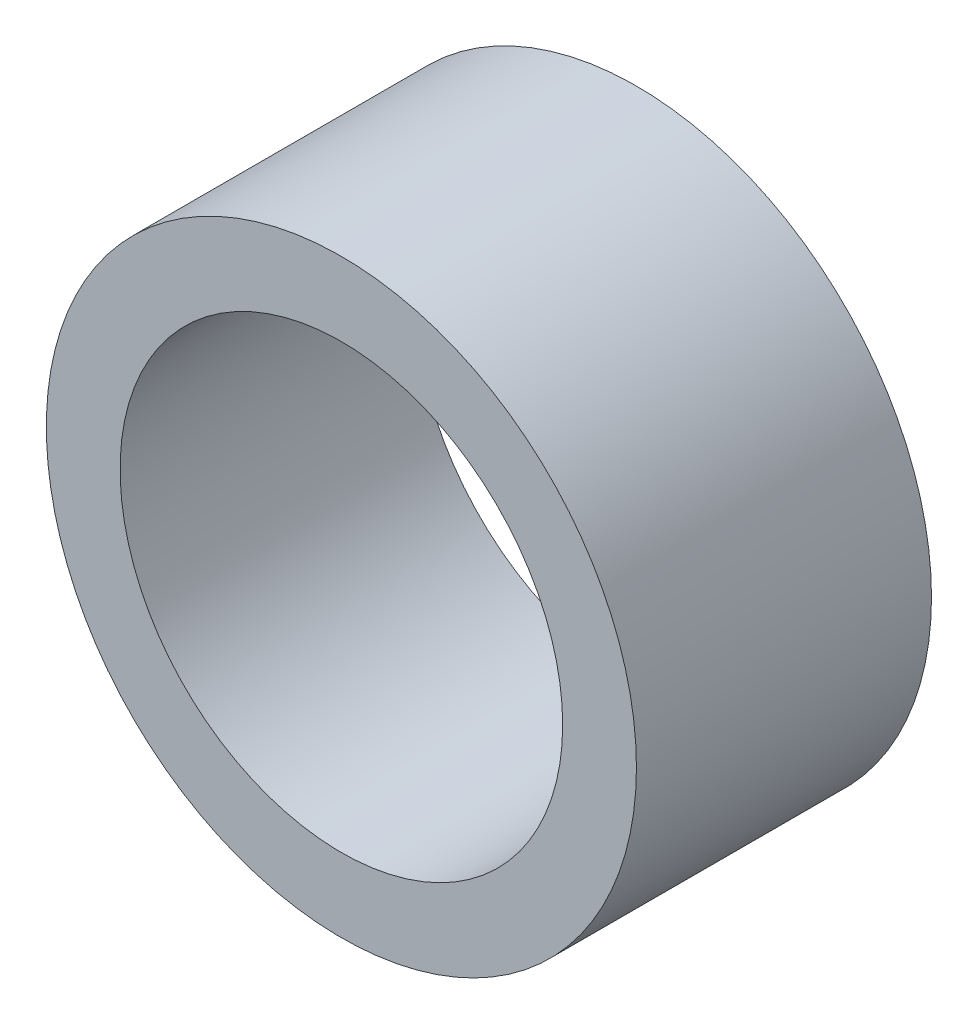
ISO-10303-21;
HEADER;
FILE_DESCRIPTION(('STEP AP214'),'2;1');
FILE_NAME('part.step','',(''),(''),'','','');
FILE_SCHEMA(('AUTOMOTIVE_DESIGN { 1 0 10303 214 1 1 1 1 }'));
ENDSEC;
DATA;
#1=APPLICATION_CONTEXT('core data for automotive mechanical design processes');
#2=APPLICATION_PROTOCOL_DEFINITION('international standard','automotive_design',2000,#1);
#3=PRODUCT_CONTEXT('',#1,'mechanical');
#4=PRODUCT('Part','Part','',(#3));
#5=PRODUCT_RELATED_PRODUCT_CATEGORY('part','',(#4));
#6=PRODUCT_DEFINITION_FORMATION('','',#4);
#7=PRODUCT_DEFINITION_CONTEXT('part definition',#1,'design');
#8=PRODUCT_DEFINITION('design','',#6,#7);
#9=PRODUCT_DEFINITION_SHAPE('','',#8);
#10=(LENGTH_UNIT() NAMED_UNIT(*) SI_UNIT(.MILLI.,.METRE.));
#11=(NAMED_UNIT(*) PLANE_ANGLE_UNIT() SI_UNIT($,.RADIAN.));
#12=(NAMED_UNIT(*) SI_UNIT($,.STERADIAN.) SOLID_ANGLE_UNIT());
#13=UNCERTAINTY_MEASURE_WITH_UNIT(LENGTH_MEASURE(1.E-05),#10,'distance_accuracy_value','');
#14=(GEOMETRIC_REPRESENTATION_CONTEXT(3) GLOBAL_UNCERTAINTY_ASSIGNED_CONTEXT((#13)) GLOBAL_UNIT_ASSIGNED_CONTEXT((#10,
#11,#12)) REPRESENTATION_CONTEXT('',''));
#15=CARTESIAN_POINT('',(0.,0.,0.));
#16=DIRECTION('',(0.,0.,1.));
#17=DIRECTION('',(1.,0.,0.));
#18=AXIS2_PLACEMENT_3D('',#15,#16,#17);
#19=CARTESIAN_POINT('',(0.,0.,12.7));
#20=DIRECTION('',(0.,0.,1.));
#21=DIRECTION('',(1.,0.,0.));
#22=AXIS2_PLACEMENT_3D('',#19,#20,#21);
#23=PLANE('',#22);
#24=CARTESIAN_POINT('',(0.,0.,12.7));
#25=DIRECTION('',(0.,0.,1.));
#26=DIRECTION('',(1.,0.,0.));
#27=AXIS2_PLACEMENT_3D('',#24,#25,#26);
#28=CIRCLE('',#27,12.7);
#29=CARTESIAN_POINT('',(12.7,0.,12.7));
#30=VERTEX_POINT('',#29);
#31=EDGE_CURVE('E10',#30,#30,#28,.T.);
#32=ORIENTED_EDGE('',*,*,#31,.T.);
#33=EDGE_LOOP('',(#32));
#34=FACE_BOUND('',#33,.T.);
#35=CARTESIAN_POINT('',(0.,0.,12.7));
#36=DIRECTION('',(0.,0.,1.));
#37=DIRECTION('',(1.,0.,0.));
#38=AXIS2_PLACEMENT_3D('',#35,#36,#37);
#39=CIRCLE('',#38,9.525);
#40=CARTESIAN_POINT('',(9.525,0.,12.7));
#41=VERTEX_POINT('',#40);
#42=EDGE_CURVE('E42',#41,#41,#39,.T.);
#43=ORIENTED_EDGE('',*,*,#42,.F.);
#44=EDGE_LOOP('',(#43));
#45=FACE_BOUND('',#44,.T.);
#46=ADVANCED_FACE('F31',(#34,#45),#23,.T.);
#47=CARTESIAN_POINT('',(0.,0.,0.));
#48=DIRECTION('',(0.,0.,1.));
#49=DIRECTION('',(1.,0.,0.));
#50=AXIS2_PLACEMENT_3D('',#47,#48,#49);
#51=PLANE('',#50);
#52=CARTESIAN_POINT('',(0.,0.,0.));
#53=DIRECTION('',(0.,0.,1.));
#54=DIRECTION('',(1.,0.,0.));
#55=AXIS2_PLACEMENT_3D('',#52,#53,#54);
#56=CIRCLE('',#55,12.7);
#57=CARTESIAN_POINT('',(12.7,0.,0.));
#58=VERTEX_POINT('',#57);
#59=EDGE_CURVE('E35',#58,#58,#56,.T.);
#60=ORIENTED_EDGE('',*,*,#59,.F.);
#61=EDGE_LOOP('',(#60));
#62=FACE_BOUND('',#61,.T.);
#63=CARTESIAN_POINT('',(0.,0.,0.));
#64=DIRECTION('',(0.,0.,1.));
#65=DIRECTION('',(1.,0.,0.));
#66=AXIS2_PLACEMENT_3D('',#63,#64,#65);
#67=CIRCLE('',#66,9.525);
#68=CARTESIAN_POINT('',(9.525,0.,0.));
#69=VERTEX_POINT('',#68);
#70=EDGE_CURVE('E44',#69,#69,#67,.T.);
#71=ORIENTED_EDGE('',*,*,#70,.T.);
#72=EDGE_LOOP('',(#71));
#73=FACE_BOUND('',#72,.T.);
#74=ADVANCED_FACE('F54',(#62,#73),#51,.F.);
#75=CARTESIAN_POINT('',(0.,0.,12.7));
#76=DIRECTION('',(0.,0.,-1.));
#77=DIRECTION('',(-1.,0.,0.));
#78=AXIS2_PLACEMENT_3D('',#75,#76,#77);
#79=CYLINDRICAL_SURFACE('',#78,12.7);
#80=ORIENTED_EDGE('',*,*,#31,.F.);
#81=EDGE_LOOP('',(#80));
#82=FACE_BOUND('',#81,.T.);
#83=ORIENTED_EDGE('',*,*,#59,.T.);
#84=EDGE_LOOP('',(#83));
#85=FACE_BOUND('',#84,.T.);
#86=ADVANCED_FACE('F33',(#82,#85),#79,.T.);
#87=CARTESIAN_POINT('',(0.,0.,12.7));
#88=DIRECTION('',(0.,0.,-1.));
#89=DIRECTION('',(-1.,0.,0.));
#90=AXIS2_PLACEMENT_3D('',#87,#88,#89);
#91=CYLINDRICAL_SURFACE('',#90,9.525);
#92=ORIENTED_EDGE('',*,*,#42,.T.);
#93=EDGE_LOOP('',(#92));
#94=FACE_BOUND('',#93,.T.);
#95=ORIENTED_EDGE('',*,*,#70,.F.);
#96=EDGE_LOOP('',(#95));
#97=FACE_BOUND('',#96,.T.);
#98=ADVANCED_FACE('F50',(#94,#97),#91,.F.);
#99=CLOSED_SHELL('',(#46,#74,#86,#98));
#100=MANIFOLD_SOLID_BREP('B2',#99);
#101=ADVANCED_BREP_SHAPE_REPRESENTATION('',(#18,#100),#14);
#102=SHAPE_DEFINITION_REPRESENTATION(#9,#101);
ENDSEC;
END-ISO-10303-21;
